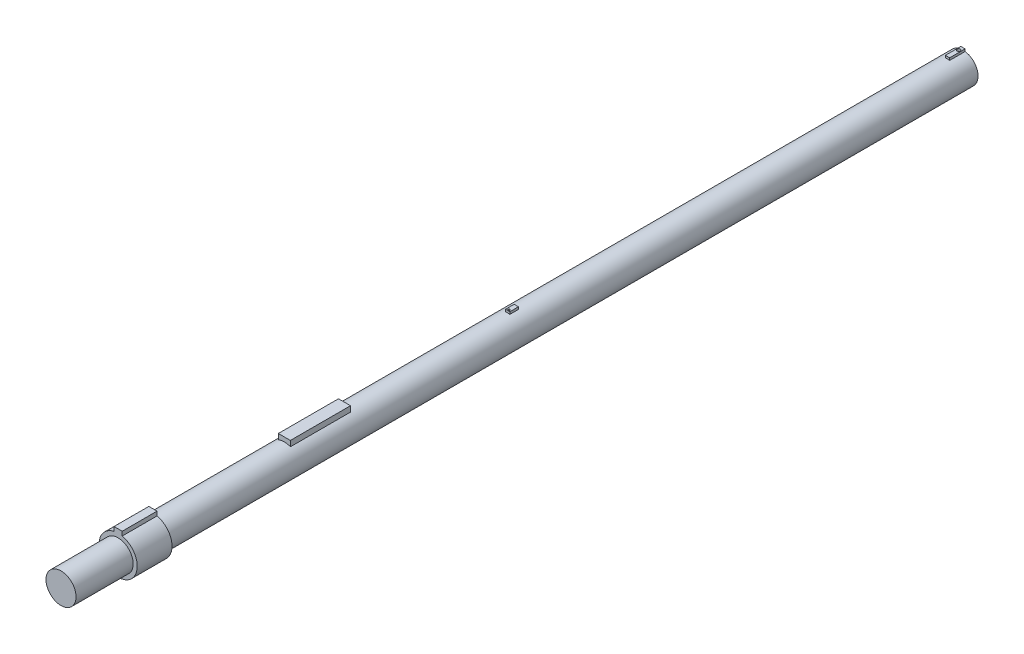
ISO-10303-21;
HEADER;
FILE_DESCRIPTION(('STEP AP214'),'2;1');
FILE_NAME('part.step','',(''),(''),'','','');
FILE_SCHEMA(('AUTOMOTIVE_DESIGN { 1 0 10303 214 1 1 1 1 }'));
ENDSEC;
DATA;
#1=APPLICATION_CONTEXT('core data for automotive mechanical design processes');
#2=APPLICATION_PROTOCOL_DEFINITION('international standard','automotive_design',2000,#1);
#3=PRODUCT_CONTEXT('',#1,'mechanical');
#4=PRODUCT('Part','Part','',(#3));
#5=PRODUCT_RELATED_PRODUCT_CATEGORY('part','',(#4));
#6=PRODUCT_DEFINITION_FORMATION('','',#4);
#7=PRODUCT_DEFINITION_CONTEXT('part definition',#1,'design');
#8=PRODUCT_DEFINITION('design','',#6,#7);
#9=PRODUCT_DEFINITION_SHAPE('','',#8);
#10=(LENGTH_UNIT() NAMED_UNIT(*) SI_UNIT(.MILLI.,.METRE.));
#11=(NAMED_UNIT(*) PLANE_ANGLE_UNIT() SI_UNIT($,.RADIAN.));
#12=(NAMED_UNIT(*) SI_UNIT($,.STERADIAN.) SOLID_ANGLE_UNIT());
#13=UNCERTAINTY_MEASURE_WITH_UNIT(LENGTH_MEASURE(1.E-05),#10,'distance_accuracy_value','');
#14=(GEOMETRIC_REPRESENTATION_CONTEXT(3) GLOBAL_UNCERTAINTY_ASSIGNED_CONTEXT((#13)) GLOBAL_UNIT_ASSIGNED_CONTEXT((#10,
#11,#12)) REPRESENTATION_CONTEXT('',''));
#15=CARTESIAN_POINT('',(0.,0.,0.));
#16=DIRECTION('',(0.,0.,1.));
#17=DIRECTION('',(1.,0.,0.));
#18=AXIS2_PLACEMENT_3D('',#15,#16,#17);
#19=CARTESIAN_POINT('',(0.,0.,1050.));
#20=DIRECTION('',(0.,0.,-1.));
#21=DIRECTION('',(-1.,0.,0.));
#22=AXIS2_PLACEMENT_3D('',#19,#20,#21);
#23=CYLINDRICAL_SURFACE('',#22,17.5);
#24=CARTESIAN_POINT('',(0.,0.,943.));
#25=DIRECTION('',(0.,0.,1.));
#26=DIRECTION('',(1.,0.,0.));
#27=AXIS2_PLACEMENT_3D('',#24,#25,#26);
#28=CIRCLE('',#27,17.5);
#29=CARTESIAN_POINT('',(17.5,0.,943.));
#30=VERTEX_POINT('',#29);
#31=EDGE_CURVE('E333',#30,#30,#28,.T.);
#32=ORIENTED_EDGE('',*,*,#31,.F.);
#33=EDGE_LOOP('',(#32));
#34=FACE_BOUND('',#33,.T.);
#35=DIRECTION('',(0.,0.,-1.));
#36=VECTOR('',#35,1.);
#37=CARTESIAN_POINT('',(-2.5,17.3205080756888,1050.));
#38=LINE('',#37,#36);
#39=CARTESIAN_POINT('',(-2.5,17.3205080756888,530.));
#40=VERTEX_POINT('',#39);
#41=CARTESIAN_POINT('',(-2.5,17.3205080756888,520.));
#42=VERTEX_POINT('',#41);
#43=EDGE_CURVE('E324',#40,#42,#38,.T.);
#44=ORIENTED_EDGE('',*,*,#43,.T.);
#45=CARTESIAN_POINT('',(0.,0.,520.));
#46=DIRECTION('',(0.,0.,-1.));
#47=DIRECTION('',(-1.,0.,0.));
#48=AXIS2_PLACEMENT_3D('',#45,#46,#47);
#49=CIRCLE('',#48,17.5);
#50=CARTESIAN_POINT('',(2.5,17.3205080756888,520.));
#51=VERTEX_POINT('',#50);
#52=EDGE_CURVE('E330',#42,#51,#49,.T.);
#53=ORIENTED_EDGE('',*,*,#52,.T.);
#54=DIRECTION('',(0.,0.,-1.));
#55=VECTOR('',#54,1.);
#56=CARTESIAN_POINT('',(2.5,17.3205080756888,1050.));
#57=LINE('',#56,#55);
#58=CARTESIAN_POINT('',(2.5,17.3205080756888,530.));
#59=VERTEX_POINT('',#58);
#60=EDGE_CURVE('E327',#51,#59,#57,.F.);
#61=ORIENTED_EDGE('',*,*,#60,.T.);
#62=CARTESIAN_POINT('',(0.,0.,530.));
#63=DIRECTION('',(0.,0.,-1.));
#64=DIRECTION('',(-1.,0.,0.));
#65=AXIS2_PLACEMENT_3D('',#62,#63,#64);
#66=CIRCLE('',#65,17.5);
#67=EDGE_CURVE('E318',#40,#59,#66,.T.);
#68=ORIENTED_EDGE('',*,*,#67,.F.);
#69=EDGE_LOOP('',(#44,#53,#61,#68));
#70=FACE_BOUND('',#69,.T.);
#71=CARTESIAN_POINT('',(0.,0.,0.));
#72=DIRECTION('',(0.,0.,1.));
#73=DIRECTION('',(1.,0.,0.));
#74=AXIS2_PLACEMENT_3D('',#71,#72,#73);
#75=CIRCLE('',#74,17.5);
#76=CARTESIAN_POINT('',(-2.5,17.3205080756888,0.));
#77=VERTEX_POINT('',#76);
#78=CARTESIAN_POINT('',(2.5,17.3205080756888,0.));
#79=VERTEX_POINT('',#78);
#80=EDGE_CURVE('E310',#77,#79,#75,.T.);
#81=ORIENTED_EDGE('',*,*,#80,.T.);
#82=DIRECTION('',(0.,0.,-1.));
#83=VECTOR('',#82,1.);
#84=CARTESIAN_POINT('',(2.5,17.3205080756888,1050.));
#85=LINE('',#84,#83);
#86=CARTESIAN_POINT('',(2.5,17.3205080756888,18.));
#87=VERTEX_POINT('',#86);
#88=EDGE_CURVE('E63',#79,#87,#85,.F.);
#89=ORIENTED_EDGE('',*,*,#88,.T.);
#90=CARTESIAN_POINT('',(0.,0.,18.));
#91=DIRECTION('',(0.,0.,-1.));
#92=DIRECTION('',(-1.,0.,0.));
#93=AXIS2_PLACEMENT_3D('',#90,#91,#92);
#94=CIRCLE('',#93,17.5);
#95=CARTESIAN_POINT('',(-2.5,17.3205080756888,18.));
#96=VERTEX_POINT('',#95);
#97=EDGE_CURVE('E337',#96,#87,#94,.T.);
#98=ORIENTED_EDGE('',*,*,#97,.F.);
#99=DIRECTION('',(0.,0.,-1.));
#100=VECTOR('',#99,1.);
#101=CARTESIAN_POINT('',(-2.5,17.3205080756888,1050.));
#102=LINE('',#101,#100);
#103=EDGE_CURVE('E233',#96,#77,#102,.T.);
#104=ORIENTED_EDGE('',*,*,#103,.T.);
#105=EDGE_LOOP('',(#81,#89,#98,#104));
#106=FACE_BOUND('',#105,.T.);
#107=CARTESIAN_POINT('',(0.,0.,720.));
#108=DIRECTION('',(0.,0.,1.));
#109=DIRECTION('',(1.,0.,0.));
#110=AXIS2_PLACEMENT_3D('',#107,#108,#109);
#111=CIRCLE('',#110,17.5);
#112=CARTESIAN_POINT('',(7.,16.0390149323454,720.));
#113=VERTEX_POINT('',#112);
#114=CARTESIAN_POINT('',(-7.,16.0390149323454,720.));
#115=VERTEX_POINT('',#114);
#116=EDGE_CURVE('E11',#113,#115,#111,.T.);
#117=ORIENTED_EDGE('',*,*,#116,.F.);
#118=DIRECTION('',(0.,0.,-1.));
#119=VECTOR('',#118,1.);
#120=CARTESIAN_POINT('',(7.,16.0390149323454,1050.));
#121=LINE('',#120,#119);
#122=CARTESIAN_POINT('',(7.,16.0390149323454,790.));
#123=VERTEX_POINT('',#122);
#124=EDGE_CURVE('E160',#113,#123,#121,.F.);
#125=ORIENTED_EDGE('',*,*,#124,.T.);
#126=CARTESIAN_POINT('',(0.,0.,790.));
#127=DIRECTION('',(0.,0.,1.));
#128=DIRECTION('',(1.,0.,0.));
#129=AXIS2_PLACEMENT_3D('',#126,#127,#128);
#130=CIRCLE('',#129,17.5);
#131=CARTESIAN_POINT('',(-7.,16.0390149323454,790.));
#132=VERTEX_POINT('',#131);
#133=EDGE_CURVE('E343',#123,#132,#130,.T.);
#134=ORIENTED_EDGE('',*,*,#133,.T.);
#135=DIRECTION('',(0.,0.,-1.));
#136=VECTOR('',#135,1.);
#137=CARTESIAN_POINT('',(-7.,16.0390149323454,1050.));
#138=LINE('',#137,#136);
#139=EDGE_CURVE('E48',#132,#115,#138,.T.);
#140=ORIENTED_EDGE('',*,*,#139,.T.);
#141=EDGE_LOOP('',(#117,#125,#134,#140));
#142=FACE_BOUND('',#141,.T.);
#143=ADVANCED_FACE('F39',(#34,#70,#106,#142),#23,.T.);
#144=CARTESIAN_POINT('',(0.,0.,0.));
#145=DIRECTION('',(0.,0.,1.));
#146=DIRECTION('',(1.,0.,0.));
#147=AXIS2_PLACEMENT_3D('',#144,#145,#146);
#148=PLANE('',#147);
#149=ORIENTED_EDGE('',*,*,#80,.F.);
#150=DIRECTION('',(0.,1.,0.));
#151=VECTOR('',#150,1.);
#152=CARTESIAN_POINT('',(-2.5,15.,0.));
#153=LINE('',#152,#151);
#154=CARTESIAN_POINT('',(-2.5,20.,0.));
#155=VERTEX_POINT('',#154);
#156=EDGE_CURVE('E224',#77,#155,#153,.T.);
#157=ORIENTED_EDGE('',*,*,#156,.T.);
#158=DIRECTION('',(1.,0.,0.));
#159=VECTOR('',#158,1.);
#160=CARTESIAN_POINT('',(-2.5,20.,0.));
#161=LINE('',#160,#159);
#162=CARTESIAN_POINT('',(2.5,20.,0.));
#163=VERTEX_POINT('',#162);
#164=EDGE_CURVE('E213',#155,#163,#161,.T.);
#165=ORIENTED_EDGE('',*,*,#164,.T.);
#166=DIRECTION('',(0.,-1.,0.));
#167=VECTOR('',#166,1.);
#168=CARTESIAN_POINT('',(2.5,15.,0.));
#169=LINE('',#168,#167);
#170=EDGE_CURVE('E204',#163,#79,#169,.T.);
#171=ORIENTED_EDGE('',*,*,#170,.T.);
#172=EDGE_LOOP('',(#149,#157,#165,#171));
#173=FACE_BOUND('',#172,.T.);
#174=ADVANCED_FACE('F363',(#173),#148,.F.);
#175=CARTESIAN_POINT('',(2.5,15.,520.));
#176=DIRECTION('',(1.,0.,0.));
#177=DIRECTION('',(0.,0.,-1.));
#178=AXIS2_PLACEMENT_3D('',#175,#176,#177);
#179=PLANE('',#178);
#180=ORIENTED_EDGE('',*,*,#60,.F.);
#181=DIRECTION('',(0.,1.,0.));
#182=VECTOR('',#181,1.);
#183=CARTESIAN_POINT('',(2.5,15.,520.));
#184=LINE('',#183,#182);
#185=CARTESIAN_POINT('',(2.5,20.,520.));
#186=VERTEX_POINT('',#185);
#187=EDGE_CURVE('E295',#51,#186,#184,.T.);
#188=ORIENTED_EDGE('',*,*,#187,.T.);
#189=DIRECTION('',(0.,0.,1.));
#190=VECTOR('',#189,1.);
#191=CARTESIAN_POINT('',(2.5,20.,520.));
#192=LINE('',#191,#190);
#193=CARTESIAN_POINT('',(2.5,20.,530.));
#194=VERTEX_POINT('',#193);
#195=EDGE_CURVE('E306',#186,#194,#192,.T.);
#196=ORIENTED_EDGE('',*,*,#195,.T.);
#197=DIRECTION('',(0.,1.,0.));
#198=VECTOR('',#197,1.);
#199=CARTESIAN_POINT('',(2.5,15.,530.));
#200=LINE('',#199,#198);
#201=EDGE_CURVE('E284',#59,#194,#200,.T.);
#202=ORIENTED_EDGE('',*,*,#201,.F.);
#203=EDGE_LOOP('',(#180,#188,#196,#202));
#204=FACE_BOUND('',#203,.T.);
#205=ADVANCED_FACE('F370',(#204),#179,.T.);
#206=CARTESIAN_POINT('',(-2.5,15.,520.));
#207=DIRECTION('',(-1.,0.,0.));
#208=DIRECTION('',(0.,0.,1.));
#209=AXIS2_PLACEMENT_3D('',#206,#207,#208);
#210=PLANE('',#209);
#211=ORIENTED_EDGE('',*,*,#43,.F.);
#212=DIRECTION('',(0.,-1.,0.));
#213=VECTOR('',#212,1.);
#214=CARTESIAN_POINT('',(-2.5,15.,530.));
#215=LINE('',#214,#213);
#216=CARTESIAN_POINT('',(-2.5,20.,530.));
#217=VERTEX_POINT('',#216);
#218=EDGE_CURVE('E291',#217,#40,#215,.T.);
#219=ORIENTED_EDGE('',*,*,#218,.F.);
#220=DIRECTION('',(0.,0.,1.));
#221=VECTOR('',#220,1.);
#222=CARTESIAN_POINT('',(-2.5,20.,520.));
#223=LINE('',#222,#221);
#224=CARTESIAN_POINT('',(-2.5,20.,520.));
#225=VERTEX_POINT('',#224);
#226=EDGE_CURVE('E307',#225,#217,#223,.T.);
#227=ORIENTED_EDGE('',*,*,#226,.F.);
#228=DIRECTION('',(0.,-1.,0.));
#229=VECTOR('',#228,1.);
#230=CARTESIAN_POINT('',(-2.5,15.,520.));
#231=LINE('',#230,#229);
#232=EDGE_CURVE('E302',#225,#42,#231,.T.);
#233=ORIENTED_EDGE('',*,*,#232,.T.);
#234=EDGE_LOOP('',(#211,#219,#227,#233));
#235=FACE_BOUND('',#234,.T.);
#236=ADVANCED_FACE('F416',(#235),#210,.T.);
#237=CARTESIAN_POINT('',(-2.5,20.,520.));
#238=DIRECTION('',(0.,1.,0.));
#239=DIRECTION('',(0.,0.,1.));
#240=AXIS2_PLACEMENT_3D('',#237,#238,#239);
#241=PLANE('',#240);
#242=CARTESIAN_POINT('',(0.,20.,528.5));
#243=DIRECTION('',(0.,1.,0.));
#244=DIRECTION('',(0.,0.,1.));
#245=AXIS2_PLACEMENT_3D('',#242,#243,#244);
#246=CIRCLE('',#245,1.);
#247=CARTESIAN_POINT('',(0.,20.,529.5));
#248=VERTEX_POINT('',#247);
#249=EDGE_CURVE('E190',#248,#248,#246,.T.);
#250=ORIENTED_EDGE('',*,*,#249,.F.);
#251=EDGE_LOOP('',(#250));
#252=FACE_BOUND('',#251,.T.);
#253=ORIENTED_EDGE('',*,*,#226,.T.);
#254=DIRECTION('',(-1.,0.,0.));
#255=VECTOR('',#254,1.);
#256=CARTESIAN_POINT('',(-2.5,20.,530.));
#257=LINE('',#256,#255);
#258=EDGE_CURVE('E287',#194,#217,#257,.T.);
#259=ORIENTED_EDGE('',*,*,#258,.F.);
#260=ORIENTED_EDGE('',*,*,#195,.F.);
#261=DIRECTION('',(-1.,0.,0.));
#262=VECTOR('',#261,1.);
#263=CARTESIAN_POINT('',(-2.5,20.,520.));
#264=LINE('',#263,#262);
#265=EDGE_CURVE('E298',#186,#225,#264,.T.);
#266=ORIENTED_EDGE('',*,*,#265,.T.);
#267=EDGE_LOOP('',(#253,#259,#260,#266));
#268=FACE_BOUND('',#267,.T.);
#269=ADVANCED_FACE('F414',(#252,#268),#241,.T.);
#270=CARTESIAN_POINT('',(0.,0.,520.));
#271=DIRECTION('',(0.,0.,-1.));
#272=DIRECTION('',(-1.,0.,0.));
#273=AXIS2_PLACEMENT_3D('',#270,#271,#272);
#274=PLANE('',#273);
#275=ORIENTED_EDGE('',*,*,#52,.F.);
#276=ORIENTED_EDGE('',*,*,#232,.F.);
#277=ORIENTED_EDGE('',*,*,#265,.F.);
#278=ORIENTED_EDGE('',*,*,#187,.F.);
#279=EDGE_LOOP('',(#275,#276,#277,#278));
#280=FACE_BOUND('',#279,.T.);
#281=ADVANCED_FACE('F410',(#280),#274,.T.);
#282=CARTESIAN_POINT('',(0.,0.,530.));
#283=DIRECTION('',(0.,0.,-1.));
#284=DIRECTION('',(-1.,0.,0.));
#285=AXIS2_PLACEMENT_3D('',#282,#283,#284);
#286=PLANE('',#285);
#287=ORIENTED_EDGE('',*,*,#218,.T.);
#288=ORIENTED_EDGE('',*,*,#67,.T.);
#289=ORIENTED_EDGE('',*,*,#201,.T.);
#290=ORIENTED_EDGE('',*,*,#258,.T.);
#291=EDGE_LOOP('',(#287,#288,#289,#290));
#292=FACE_BOUND('',#291,.T.);
#293=ADVANCED_FACE('F403',(#292),#286,.F.);
#294=CARTESIAN_POINT('',(0.,0.,983.50047623));
#295=DIRECTION('',(0.,0.,-1.));
#296=DIRECTION('',(-1.,0.,0.));
#297=AXIS2_PLACEMENT_3D('',#294,#295,#296);
#298=CYLINDRICAL_SURFACE('',#297,22.225);
#299=CARTESIAN_POINT('',(0.,0.,983.50047623));
#300=DIRECTION('',(0.,0.,1.));
#301=DIRECTION('',(1.,0.,0.));
#302=AXIS2_PLACEMENT_3D('',#299,#300,#301);
#303=CIRCLE('',#302,22.225);
#304=CARTESIAN_POINT('',(-4.765,21.7081873955427,983.50047623));
#305=VERTEX_POINT('',#304);
#306=CARTESIAN_POINT('',(4.765,21.7081873955427,983.50047623));
#307=VERTEX_POINT('',#306);
#308=EDGE_CURVE('E276',#305,#307,#303,.T.);
#309=ORIENTED_EDGE('',*,*,#308,.F.);
#310=DIRECTION('',(0.,0.,-1.));
#311=VECTOR('',#310,1.);
#312=CARTESIAN_POINT('',(-4.765,21.7081873955427,983.50047623));
#313=LINE('',#312,#311);
#314=CARTESIAN_POINT('',(-4.765,21.7081873955427,943.));
#315=VERTEX_POINT('',#314);
#316=EDGE_CURVE('E271',#305,#315,#313,.T.);
#317=ORIENTED_EDGE('',*,*,#316,.T.);
#318=CARTESIAN_POINT('',(0.,0.,943.));
#319=DIRECTION('',(0.,0.,1.));
#320=DIRECTION('',(1.,0.,0.));
#321=AXIS2_PLACEMENT_3D('',#318,#319,#320);
#322=CIRCLE('',#321,22.225);
#323=CARTESIAN_POINT('',(4.765,21.7081873955427,943.));
#324=VERTEX_POINT('',#323);
#325=EDGE_CURVE('E275',#315,#324,#322,.T.);
#326=ORIENTED_EDGE('',*,*,#325,.T.);
#327=DIRECTION('',(0.,0.,-1.));
#328=VECTOR('',#327,1.);
#329=CARTESIAN_POINT('',(4.765,21.7081873955427,983.50047623));
#330=LINE('',#329,#328);
#331=EDGE_CURVE('E265',#307,#324,#330,.T.);
#332=ORIENTED_EDGE('',*,*,#331,.F.);
#333=EDGE_LOOP('',(#309,#317,#326,#332));
#334=FACE_BOUND('',#333,.T.);
#335=ADVANCED_FACE('F394',(#334),#298,.T.);
#336=CARTESIAN_POINT('',(0.,0.,983.50047623));
#337=DIRECTION('',(0.,0.,1.));
#338=DIRECTION('',(1.,0.,0.));
#339=AXIS2_PLACEMENT_3D('',#336,#337,#338);
#340=PLANE('',#339);
#341=ORIENTED_EDGE('',*,*,#308,.T.);
#342=DIRECTION('',(0.,-1.,0.));
#343=VECTOR('',#342,1.);
#344=CARTESIAN_POINT('',(4.765,26.595,983.50047623));
#345=LINE('',#344,#343);
#346=CARTESIAN_POINT('',(4.765,26.595,983.50047623));
#347=VERTEX_POINT('',#346);
#348=EDGE_CURVE('E257',#347,#307,#345,.T.);
#349=ORIENTED_EDGE('',*,*,#348,.F.);
#350=DIRECTION('',(1.,0.,0.));
#351=VECTOR('',#350,1.);
#352=CARTESIAN_POINT('',(-4.765,26.595,983.50047623));
#353=LINE('',#352,#351);
#354=CARTESIAN_POINT('',(-4.765,26.595,983.50047623));
#355=VERTEX_POINT('',#354);
#356=EDGE_CURVE('E247',#355,#347,#353,.T.);
#357=ORIENTED_EDGE('',*,*,#356,.F.);
#358=DIRECTION('',(0.,-1.,0.));
#359=VECTOR('',#358,1.);
#360=CARTESIAN_POINT('',(-4.765,26.595,983.50047623));
#361=LINE('',#360,#359);
#362=EDGE_CURVE('E242',#355,#305,#361,.T.);
#363=ORIENTED_EDGE('',*,*,#362,.T.);
#364=EDGE_LOOP('',(#341,#349,#357,#363));
#365=FACE_BOUND('',#364,.T.);
#366=CARTESIAN_POINT('',(0.,0.,983.50047623));
#367=DIRECTION('',(0.,0.,1.));
#368=DIRECTION('',(1.,0.,0.));
#369=AXIS2_PLACEMENT_3D('',#366,#367,#368);
#370=CIRCLE('',#369,17.5);
#371=CARTESIAN_POINT('',(17.5,0.,983.50047623));
#372=VERTEX_POINT('',#371);
#373=EDGE_CURVE('E280',#372,#372,#370,.T.);
#374=ORIENTED_EDGE('',*,*,#373,.F.);
#375=EDGE_LOOP('',(#374));
#376=FACE_BOUND('',#375,.T.);
#377=ADVANCED_FACE('F392',(#365,#376),#340,.T.);
#378=CARTESIAN_POINT('',(0.,0.,943.));
#379=DIRECTION('',(0.,0.,1.));
#380=DIRECTION('',(1.,0.,0.));
#381=AXIS2_PLACEMENT_3D('',#378,#379,#380);
#382=PLANE('',#381);
#383=ORIENTED_EDGE('',*,*,#31,.T.);
#384=EDGE_LOOP('',(#383));
#385=FACE_BOUND('',#384,.T.);
#386=ORIENTED_EDGE('',*,*,#325,.F.);
#387=DIRECTION('',(0.,-1.,0.));
#388=VECTOR('',#387,1.);
#389=CARTESIAN_POINT('',(-4.765,26.595,943.));
#390=LINE('',#389,#388);
#391=CARTESIAN_POINT('',(-4.765,26.595,943.));
#392=VERTEX_POINT('',#391);
#393=EDGE_CURVE('E243',#392,#315,#390,.T.);
#394=ORIENTED_EDGE('',*,*,#393,.F.);
#395=DIRECTION('',(1.,0.,0.));
#396=VECTOR('',#395,1.);
#397=CARTESIAN_POINT('',(-4.765,26.595,943.));
#398=LINE('',#397,#396);
#399=CARTESIAN_POINT('',(4.765,26.595,943.));
#400=VERTEX_POINT('',#399);
#401=EDGE_CURVE('E251',#392,#400,#398,.T.);
#402=ORIENTED_EDGE('',*,*,#401,.T.);
#403=DIRECTION('',(0.,-1.,0.));
#404=VECTOR('',#403,1.);
#405=CARTESIAN_POINT('',(4.765,26.595,943.));
#406=LINE('',#405,#404);
#407=EDGE_CURVE('E246',#400,#324,#406,.T.);
#408=ORIENTED_EDGE('',*,*,#407,.T.);
#409=EDGE_LOOP('',(#386,#394,#402,#408));
#410=FACE_BOUND('',#409,.T.);
#411=ADVANCED_FACE('F385',(#385,#410),#382,.F.);
#412=CARTESIAN_POINT('',(0.,0.,1050.));
#413=DIRECTION('',(0.,0.,1.));
#414=DIRECTION('',(1.,0.,0.));
#415=AXIS2_PLACEMENT_3D('',#412,#413,#414);
#416=PLANE('',#415);
#417=CARTESIAN_POINT('',(0.,0.,1050.));
#418=DIRECTION('',(0.,0.,1.));
#419=DIRECTION('',(1.,0.,0.));
#420=AXIS2_PLACEMENT_3D('',#417,#418,#419);
#421=CIRCLE('',#420,17.5);
#422=CARTESIAN_POINT('',(17.5,0.,1050.));
#423=VERTEX_POINT('',#422);
#424=EDGE_CURVE('E314',#423,#423,#421,.T.);
#425=ORIENTED_EDGE('',*,*,#424,.T.);
#426=EDGE_LOOP('',(#425));
#427=FACE_BOUND('',#426,.T.);
#428=ADVANCED_FACE('F376',(#427),#416,.T.);
#429=ORIENTED_EDGE('',*,*,#373,.T.);
#430=EDGE_LOOP('',(#429));
#431=FACE_BOUND('',#430,.T.);
#432=ORIENTED_EDGE('',*,*,#424,.F.);
#433=EDGE_LOOP('',(#432));
#434=FACE_BOUND('',#433,.T.);
#435=ADVANCED_FACE('F41',(#431,#434),#23,.T.);
#436=CARTESIAN_POINT('',(-4.765,26.595,943.));
#437=DIRECTION('',(-1.,0.,0.));
#438=DIRECTION('',(0.,-1.,0.));
#439=AXIS2_PLACEMENT_3D('',#436,#437,#438);
#440=PLANE('',#439);
#441=ORIENTED_EDGE('',*,*,#316,.F.);
#442=ORIENTED_EDGE('',*,*,#362,.F.);
#443=DIRECTION('',(0.,0.,1.));
#444=VECTOR('',#443,1.);
#445=CARTESIAN_POINT('',(-4.765,26.595,943.));
#446=LINE('',#445,#444);
#447=EDGE_CURVE('E262',#392,#355,#446,.T.);
#448=ORIENTED_EDGE('',*,*,#447,.F.);
#449=ORIENTED_EDGE('',*,*,#393,.T.);
#450=EDGE_LOOP('',(#441,#442,#448,#449));
#451=FACE_BOUND('',#450,.T.);
#452=ADVANCED_FACE('F375',(#451),#440,.T.);
#453=CARTESIAN_POINT('',(4.765,26.595,943.));
#454=DIRECTION('',(-1.,0.,0.));
#455=DIRECTION('',(0.,-1.,0.));
#456=AXIS2_PLACEMENT_3D('',#453,#454,#455);
#457=PLANE('',#456);
#458=ORIENTED_EDGE('',*,*,#348,.T.);
#459=ORIENTED_EDGE('',*,*,#331,.T.);
#460=ORIENTED_EDGE('',*,*,#407,.F.);
#461=DIRECTION('',(0.,0.,1.));
#462=VECTOR('',#461,1.);
#463=CARTESIAN_POINT('',(4.765,26.595,943.));
#464=LINE('',#463,#462);
#465=EDGE_CURVE('E254',#400,#347,#464,.T.);
#466=ORIENTED_EDGE('',*,*,#465,.T.);
#467=EDGE_LOOP('',(#458,#459,#460,#466));
#468=FACE_BOUND('',#467,.T.);
#469=ADVANCED_FACE('F382',(#468),#457,.F.);
#470=CARTESIAN_POINT('',(-4.765,26.595,943.));
#471=DIRECTION('',(0.,-1.,0.));
#472=DIRECTION('',(0.,0.,-1.));
#473=AXIS2_PLACEMENT_3D('',#470,#471,#472);
#474=PLANE('',#473);
#475=ORIENTED_EDGE('',*,*,#356,.T.);
#476=ORIENTED_EDGE('',*,*,#465,.F.);
#477=ORIENTED_EDGE('',*,*,#401,.F.);
#478=ORIENTED_EDGE('',*,*,#447,.T.);
#479=EDGE_LOOP('',(#475,#476,#477,#478));
#480=FACE_BOUND('',#479,.T.);
#481=ADVANCED_FACE('F462',(#480),#474,.F.);
#482=CARTESIAN_POINT('',(2.5,15.,18.));
#483=DIRECTION('',(1.,0.,0.));
#484=DIRECTION('',(0.,0.,-1.));
#485=AXIS2_PLACEMENT_3D('',#482,#483,#484);
#486=PLANE('',#485);
#487=ORIENTED_EDGE('',*,*,#88,.F.);
#488=ORIENTED_EDGE('',*,*,#170,.F.);
#489=DIRECTION('',(0.,0.,-1.));
#490=VECTOR('',#489,1.);
#491=CARTESIAN_POINT('',(2.5,20.,18.));
#492=LINE('',#491,#490);
#493=CARTESIAN_POINT('',(2.5,20.,18.));
#494=VERTEX_POINT('',#493);
#495=EDGE_CURVE('E230',#494,#163,#492,.T.);
#496=ORIENTED_EDGE('',*,*,#495,.F.);
#497=DIRECTION('',(0.,-1.,0.));
#498=VECTOR('',#497,1.);
#499=CARTESIAN_POINT('',(2.5,15.,18.));
#500=LINE('',#499,#498);
#501=EDGE_CURVE('E208',#494,#87,#500,.T.);
#502=ORIENTED_EDGE('',*,*,#501,.T.);
#503=EDGE_LOOP('',(#487,#488,#496,#502));
#504=FACE_BOUND('',#503,.T.);
#505=ADVANCED_FACE('F442',(#504),#486,.T.);
#506=CARTESIAN_POINT('',(-2.5,15.,18.));
#507=DIRECTION('',(-1.,0.,0.));
#508=DIRECTION('',(0.,0.,1.));
#509=AXIS2_PLACEMENT_3D('',#506,#507,#508);
#510=PLANE('',#509);
#511=ORIENTED_EDGE('',*,*,#103,.F.);
#512=DIRECTION('',(0.,1.,0.));
#513=VECTOR('',#512,1.);
#514=CARTESIAN_POINT('',(-2.5,15.,18.));
#515=LINE('',#514,#513);
#516=CARTESIAN_POINT('',(-2.5,20.,18.));
#517=VERTEX_POINT('',#516);
#518=EDGE_CURVE('E212',#96,#517,#515,.T.);
#519=ORIENTED_EDGE('',*,*,#518,.T.);
#520=DIRECTION('',(0.,0.,-1.));
#521=VECTOR('',#520,1.);
#522=CARTESIAN_POINT('',(-2.5,20.,18.));
#523=LINE('',#522,#521);
#524=EDGE_CURVE('E220',#517,#155,#523,.T.);
#525=ORIENTED_EDGE('',*,*,#524,.T.);
#526=ORIENTED_EDGE('',*,*,#156,.F.);
#527=EDGE_LOOP('',(#511,#519,#525,#526));
#528=FACE_BOUND('',#527,.T.);
#529=ADVANCED_FACE('F453',(#528),#510,.T.);
#530=CARTESIAN_POINT('',(-2.5,20.,18.));
#531=DIRECTION('',(0.,1.,0.));
#532=DIRECTION('',(0.,0.,1.));
#533=AXIS2_PLACEMENT_3D('',#530,#531,#532);
#534=PLANE('',#533);
#535=CARTESIAN_POINT('',(0.,20.,5.));
#536=DIRECTION('',(0.,1.,0.));
#537=DIRECTION('',(0.,0.,1.));
#538=AXIS2_PLACEMENT_3D('',#535,#536,#537);
#539=CIRCLE('',#538,2.);
#540=CARTESIAN_POINT('',(0.,20.,7.));
#541=VERTEX_POINT('',#540);
#542=EDGE_CURVE('E196',#541,#541,#539,.T.);
#543=ORIENTED_EDGE('',*,*,#542,.F.);
#544=EDGE_LOOP('',(#543));
#545=FACE_BOUND('',#544,.T.);
#546=ORIENTED_EDGE('',*,*,#164,.F.);
#547=ORIENTED_EDGE('',*,*,#524,.F.);
#548=DIRECTION('',(1.,0.,0.));
#549=VECTOR('',#548,1.);
#550=CARTESIAN_POINT('',(-2.5,20.,18.));
#551=LINE('',#550,#549);
#552=EDGE_CURVE('E216',#517,#494,#551,.T.);
#553=ORIENTED_EDGE('',*,*,#552,.T.);
#554=ORIENTED_EDGE('',*,*,#495,.T.);
#555=EDGE_LOOP('',(#546,#547,#553,#554));
#556=FACE_BOUND('',#555,.T.);
#557=ADVANCED_FACE('F447',(#545,#556),#534,.T.);
#558=CARTESIAN_POINT('',(0.,0.,18.));
#559=DIRECTION('',(0.,0.,-1.));
#560=DIRECTION('',(-1.,0.,0.));
#561=AXIS2_PLACEMENT_3D('',#558,#559,#560);
#562=PLANE('',#561);
#563=ORIENTED_EDGE('',*,*,#518,.F.);
#564=ORIENTED_EDGE('',*,*,#97,.T.);
#565=ORIENTED_EDGE('',*,*,#501,.F.);
#566=ORIENTED_EDGE('',*,*,#552,.F.);
#567=EDGE_LOOP('',(#563,#564,#565,#566));
#568=FACE_BOUND('',#567,.T.);
#569=ADVANCED_FACE('F451',(#568),#562,.F.);
#570=CARTESIAN_POINT('',(0.,10.,5.));
#571=DIRECTION('',(0.,1.,0.));
#572=DIRECTION('',(0.,0.,1.));
#573=AXIS2_PLACEMENT_3D('',#570,#571,#572);
#574=CYLINDRICAL_SURFACE('',#573,2.);
#575=CARTESIAN_POINT('',(0.,10.,5.));
#576=DIRECTION('',(0.,1.,0.));
#577=DIRECTION('',(0.,0.,1.));
#578=AXIS2_PLACEMENT_3D('',#575,#576,#577);
#579=CIRCLE('',#578,2.);
#580=CARTESIAN_POINT('',(0.,10.,7.));
#581=VERTEX_POINT('',#580);
#582=EDGE_CURVE('E200',#581,#581,#579,.T.);
#583=ORIENTED_EDGE('',*,*,#582,.F.);
#584=EDGE_LOOP('',(#583));
#585=FACE_BOUND('',#584,.T.);
#586=ORIENTED_EDGE('',*,*,#542,.T.);
#587=EDGE_LOOP('',(#586));
#588=FACE_BOUND('',#587,.T.);
#589=ADVANCED_FACE('F511',(#585,#588),#574,.F.);
#590=CARTESIAN_POINT('',(0.,10.,5.));
#591=DIRECTION('',(0.,1.,0.));
#592=DIRECTION('',(0.,0.,1.));
#593=AXIS2_PLACEMENT_3D('',#590,#591,#592);
#594=PLANE('',#593);
#595=ORIENTED_EDGE('',*,*,#582,.T.);
#596=EDGE_LOOP('',(#595));
#597=FACE_BOUND('',#596,.T.);
#598=ADVANCED_FACE('F524',(#597),#594,.T.);
#599=CARTESIAN_POINT('',(0.,10.,528.5));
#600=DIRECTION('',(0.,1.,0.));
#601=DIRECTION('',(0.,0.,1.));
#602=AXIS2_PLACEMENT_3D('',#599,#600,#601);
#603=CYLINDRICAL_SURFACE('',#602,1.);
#604=CARTESIAN_POINT('',(0.,10.,528.5));
#605=DIRECTION('',(0.,1.,0.));
#606=DIRECTION('',(0.,0.,1.));
#607=AXIS2_PLACEMENT_3D('',#604,#605,#606);
#608=CIRCLE('',#607,1.);
#609=CARTESIAN_POINT('',(0.,10.,529.5));
#610=VERTEX_POINT('',#609);
#611=EDGE_CURVE('E192',#610,#610,#608,.T.);
#612=ORIENTED_EDGE('',*,*,#611,.F.);
#613=EDGE_LOOP('',(#612));
#614=FACE_BOUND('',#613,.T.);
#615=ORIENTED_EDGE('',*,*,#249,.T.);
#616=EDGE_LOOP('',(#615));
#617=FACE_BOUND('',#616,.T.);
#618=ADVANCED_FACE('F534',(#614,#617),#603,.F.);
#619=CARTESIAN_POINT('',(0.,10.,528.5));
#620=DIRECTION('',(0.,1.,0.));
#621=DIRECTION('',(0.,0.,1.));
#622=AXIS2_PLACEMENT_3D('',#619,#620,#621);
#623=PLANE('',#622);
#624=ORIENTED_EDGE('',*,*,#611,.T.);
#625=EDGE_LOOP('',(#624));
#626=FACE_BOUND('',#625,.T.);
#627=ADVANCED_FACE('F551',(#626),#623,.T.);
#628=CARTESIAN_POINT('',(-7.,12.5,720.));
#629=DIRECTION('',(-1.,0.,0.));
#630=DIRECTION('',(0.,0.,1.));
#631=AXIS2_PLACEMENT_3D('',#628,#629,#630);
#632=PLANE('',#631);
#633=ORIENTED_EDGE('',*,*,#139,.F.);
#634=DIRECTION('',(0.,-1.,0.));
#635=VECTOR('',#634,1.);
#636=CARTESIAN_POINT('',(-7.,12.5,790.));
#637=LINE('',#636,#635);
#638=CARTESIAN_POINT('',(-7.,22.5,790.));
#639=VERTEX_POINT('',#638);
#640=EDGE_CURVE('E55',#639,#132,#637,.T.);
#641=ORIENTED_EDGE('',*,*,#640,.F.);
#642=DIRECTION('',(0.,0.,1.));
#643=VECTOR('',#642,1.);
#644=CARTESIAN_POINT('',(-7.,22.5,720.));
#645=LINE('',#644,#643);
#646=CARTESIAN_POINT('',(-7.,22.5,720.));
#647=VERTEX_POINT('',#646);
#648=EDGE_CURVE('E173',#647,#639,#645,.T.);
#649=ORIENTED_EDGE('',*,*,#648,.F.);
#650=DIRECTION('',(0.,-1.,0.));
#651=VECTOR('',#650,1.);
#652=CARTESIAN_POINT('',(-7.,12.5,720.));
#653=LINE('',#652,#651);
#654=EDGE_CURVE('E166',#647,#115,#653,.T.);
#655=ORIENTED_EDGE('',*,*,#654,.T.);
#656=EDGE_LOOP('',(#633,#641,#649,#655));
#657=FACE_BOUND('',#656,.T.);
#658=ADVANCED_FACE('F352',(#657),#632,.T.);
#659=CARTESIAN_POINT('',(7.,12.5,720.));
#660=DIRECTION('',(1.,0.,0.));
#661=DIRECTION('',(0.,0.,-1.));
#662=AXIS2_PLACEMENT_3D('',#659,#660,#661);
#663=PLANE('',#662);
#664=ORIENTED_EDGE('',*,*,#124,.F.);
#665=DIRECTION('',(0.,1.,0.));
#666=VECTOR('',#665,1.);
#667=CARTESIAN_POINT('',(7.,12.5,720.));
#668=LINE('',#667,#666);
#669=CARTESIAN_POINT('',(7.,22.5,720.));
#670=VERTEX_POINT('',#669);
#671=EDGE_CURVE('E153',#113,#670,#668,.T.);
#672=ORIENTED_EDGE('',*,*,#671,.T.);
#673=DIRECTION('',(0.,0.,1.));
#674=VECTOR('',#673,1.);
#675=CARTESIAN_POINT('',(7.,22.5,720.));
#676=LINE('',#675,#674);
#677=CARTESIAN_POINT('',(7.,22.5,790.));
#678=VERTEX_POINT('',#677);
#679=EDGE_CURVE('E157',#670,#678,#676,.T.);
#680=ORIENTED_EDGE('',*,*,#679,.T.);
#681=DIRECTION('',(0.,1.,0.));
#682=VECTOR('',#681,1.);
#683=CARTESIAN_POINT('',(7.,12.5,790.));
#684=LINE('',#683,#682);
#685=EDGE_CURVE('E184',#123,#678,#684,.T.);
#686=ORIENTED_EDGE('',*,*,#685,.F.);
#687=EDGE_LOOP('',(#664,#672,#680,#686));
#688=FACE_BOUND('',#687,.T.);
#689=ADVANCED_FACE('F155',(#688),#663,.T.);
#690=CARTESIAN_POINT('',(7.,22.5,720.));
#691=DIRECTION('',(0.,1.,0.));
#692=DIRECTION('',(0.,0.,1.));
#693=AXIS2_PLACEMENT_3D('',#690,#691,#692);
#694=PLANE('',#693);
#695=DIRECTION('',(-1.,0.,0.));
#696=VECTOR('',#695,1.);
#697=CARTESIAN_POINT('',(7.,22.5,790.));
#698=LINE('',#697,#696);
#699=EDGE_CURVE('E171',#678,#639,#698,.T.);
#700=ORIENTED_EDGE('',*,*,#699,.F.);
#701=ORIENTED_EDGE('',*,*,#679,.F.);
#702=DIRECTION('',(-1.,0.,0.));
#703=VECTOR('',#702,1.);
#704=CARTESIAN_POINT('',(7.,22.5,720.));
#705=LINE('',#704,#703);
#706=EDGE_CURVE('E165',#670,#647,#705,.T.);
#707=ORIENTED_EDGE('',*,*,#706,.T.);
#708=ORIENTED_EDGE('',*,*,#648,.T.);
#709=EDGE_LOOP('',(#700,#701,#707,#708));
#710=FACE_BOUND('',#709,.T.);
#711=ADVANCED_FACE('F170',(#710),#694,.T.);
#712=CARTESIAN_POINT('',(0.,0.,720.));
#713=DIRECTION('',(0.,0.,1.));
#714=DIRECTION('',(1.,0.,0.));
#715=AXIS2_PLACEMENT_3D('',#712,#713,#714);
#716=PLANE('',#715);
#717=ORIENTED_EDGE('',*,*,#671,.F.);
#718=ORIENTED_EDGE('',*,*,#116,.T.);
#719=ORIENTED_EDGE('',*,*,#654,.F.);
#720=ORIENTED_EDGE('',*,*,#706,.F.);
#721=EDGE_LOOP('',(#717,#718,#719,#720));
#722=FACE_BOUND('',#721,.T.);
#723=ADVANCED_FACE('F176',(#722),#716,.F.);
#724=CARTESIAN_POINT('',(0.,0.,790.));
#725=DIRECTION('',(0.,0.,1.));
#726=DIRECTION('',(1.,0.,0.));
#727=AXIS2_PLACEMENT_3D('',#724,#725,#726);
#728=PLANE('',#727);
#729=ORIENTED_EDGE('',*,*,#133,.F.);
#730=ORIENTED_EDGE('',*,*,#685,.T.);
#731=ORIENTED_EDGE('',*,*,#699,.T.);
#732=ORIENTED_EDGE('',*,*,#640,.T.);
#733=EDGE_LOOP('',(#729,#730,#731,#732));
#734=FACE_BOUND('',#733,.T.);
#735=ADVANCED_FACE('F354',(#734),#728,.T.);
#736=CLOSED_SHELL('',(#143,#174,#205,#236,#269,#281,#293,#335,#377,#411,#428,#435,#452,#469,
#481,#505,#529,#557,#569,#589,#598,#618,#627,#658,#689,#711,#723,#735));
#737=MANIFOLD_SOLID_BREP('B2',#736);
#738=ADVANCED_BREP_SHAPE_REPRESENTATION('',(#18,#737),#14);
#739=SHAPE_DEFINITION_REPRESENTATION(#9,#738);
ENDSEC;
END-ISO-10303-21;
